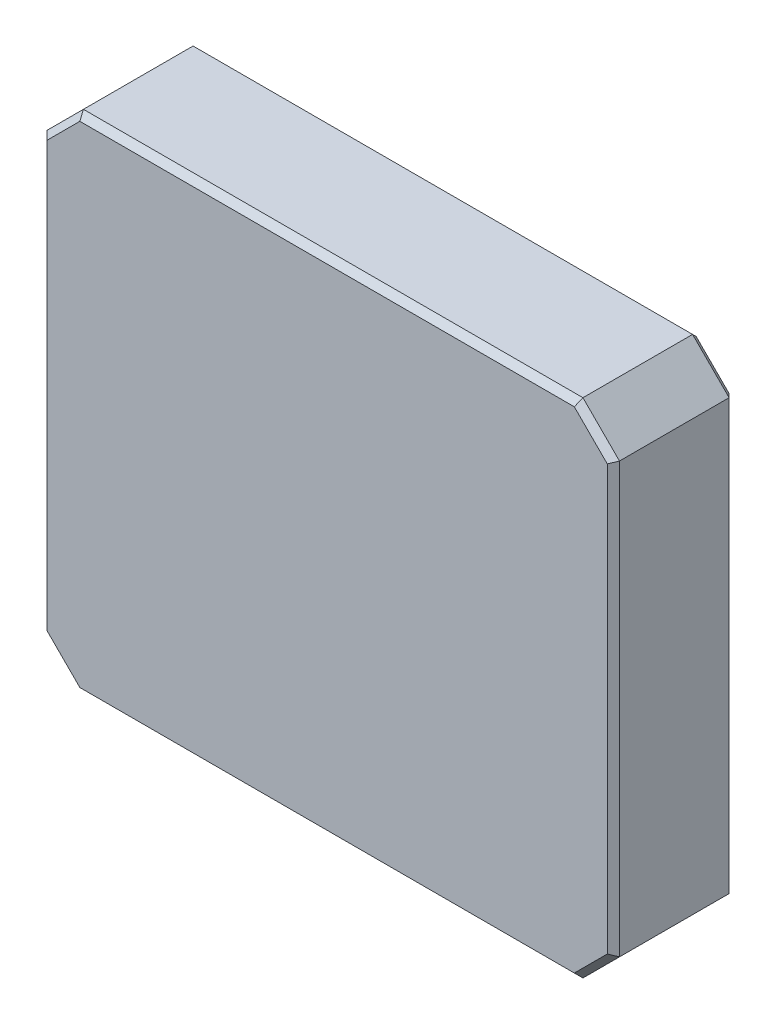
ISO-10303-21;
HEADER;
FILE_DESCRIPTION(('STEP AP214'),'2;1');
FILE_NAME('part.step','',(''),(''),'','','');
FILE_SCHEMA(('AUTOMOTIVE_DESIGN { 1 0 10303 214 1 1 1 1 }'));
ENDSEC;
DATA;
#1=APPLICATION_CONTEXT('core data for automotive mechanical design processes');
#2=APPLICATION_PROTOCOL_DEFINITION('international standard','automotive_design',2000,#1);
#3=PRODUCT_CONTEXT('',#1,'mechanical');
#4=PRODUCT('Part','Part','',(#3));
#5=PRODUCT_RELATED_PRODUCT_CATEGORY('part','',(#4));
#6=PRODUCT_DEFINITION_FORMATION('','',#4);
#7=PRODUCT_DEFINITION_CONTEXT('part definition',#1,'design');
#8=PRODUCT_DEFINITION('design','',#6,#7);
#9=PRODUCT_DEFINITION_SHAPE('','',#8);
#10=(LENGTH_UNIT() NAMED_UNIT(*) SI_UNIT(.MILLI.,.METRE.));
#11=(NAMED_UNIT(*) PLANE_ANGLE_UNIT() SI_UNIT($,.RADIAN.));
#12=(NAMED_UNIT(*) SI_UNIT($,.STERADIAN.) SOLID_ANGLE_UNIT());
#13=UNCERTAINTY_MEASURE_WITH_UNIT(LENGTH_MEASURE(1.E-05),#10,'distance_accuracy_value','');
#14=(GEOMETRIC_REPRESENTATION_CONTEXT(3) GLOBAL_UNCERTAINTY_ASSIGNED_CONTEXT((#13)) GLOBAL_UNIT_ASSIGNED_CONTEXT((#10,
#11,#12)) REPRESENTATION_CONTEXT('',''));
#15=CARTESIAN_POINT('',(0.,0.,0.));
#16=DIRECTION('',(0.,0.,1.));
#17=DIRECTION('',(1.,0.,0.));
#18=AXIS2_PLACEMENT_3D('',#15,#16,#17);
#19=CARTESIAN_POINT('',(-47.,-35.25,20.));
#20=DIRECTION('',(1.,0.,0.));
#21=DIRECTION('',(0.,0.,-1.));
#22=AXIS2_PLACEMENT_3D('',#19,#20,#21);
#23=PLANE('',#22);
#24=DIRECTION('',(0.,0.,-1.));
#25=VECTOR('',#24,1.);
#26=CARTESIAN_POINT('',(-47.,-35.25,20.));
#27=LINE('',#26,#25);
#28=CARTESIAN_POINT('',(-47.,-35.25,19.));
#29=VERTEX_POINT('',#28);
#30=CARTESIAN_POINT('',(-47.,-35.25,1.));
#31=VERTEX_POINT('',#30);
#32=EDGE_CURVE('E174',#29,#31,#27,.T.);
#33=ORIENTED_EDGE('',*,*,#32,.F.);
#34=DIRECTION('',(0.,1.,0.));
#35=VECTOR('',#34,1.);
#36=CARTESIAN_POINT('',(-47.,-35.25,19.));
#37=LINE('',#36,#35);
#38=CARTESIAN_POINT('',(-47.,35.25,19.));
#39=VERTEX_POINT('',#38);
#40=EDGE_CURVE('E215',#29,#39,#37,.T.);
#41=ORIENTED_EDGE('',*,*,#40,.T.);
#42=DIRECTION('',(0.,0.,-1.));
#43=VECTOR('',#42,1.);
#44=CARTESIAN_POINT('',(-47.,35.25,20.));
#45=LINE('',#44,#43);
#46=CARTESIAN_POINT('',(-47.,35.25,1.));
#47=VERTEX_POINT('',#46);
#48=EDGE_CURVE('E247',#39,#47,#45,.T.);
#49=ORIENTED_EDGE('',*,*,#48,.T.);
#50=DIRECTION('',(0.,-1.,0.));
#51=VECTOR('',#50,1.);
#52=CARTESIAN_POINT('',(-47.,-35.25,1.));
#53=LINE('',#52,#51);
#54=EDGE_CURVE('E213',#47,#31,#53,.T.);
#55=ORIENTED_EDGE('',*,*,#54,.T.);
#56=EDGE_LOOP('',(#33,#41,#49,#55));
#57=FACE_BOUND('',#56,.T.);
#58=ADVANCED_FACE('F38',(#57),#23,.F.);
#59=CARTESIAN_POINT('',(-47.,-35.25,20.));
#60=DIRECTION('',(0.707106781186548,0.707106781186548,0.));
#61=DIRECTION('',(-0.707106781186548,0.707106781186548,0.));
#62=AXIS2_PLACEMENT_3D('',#59,#60,#61);
#63=PLANE('',#62);
#64=DIRECTION('',(0.,0.,-1.));
#65=VECTOR('',#64,1.);
#66=CARTESIAN_POINT('',(-41.,-41.25,20.));
#67=LINE('',#66,#65);
#68=CARTESIAN_POINT('',(-41.,-41.25,19.));
#69=VERTEX_POINT('',#68);
#70=CARTESIAN_POINT('',(-41.,-41.25,1.));
#71=VERTEX_POINT('',#70);
#72=EDGE_CURVE('E312',#69,#71,#67,.T.);
#73=ORIENTED_EDGE('',*,*,#72,.F.);
#74=DIRECTION('',(-0.707106781186548,0.707106781186548,0.));
#75=VECTOR('',#74,1.);
#76=CARTESIAN_POINT('',(-47.,-35.25,19.));
#77=LINE('',#76,#75);
#78=EDGE_CURVE('E211',#69,#29,#77,.T.);
#79=ORIENTED_EDGE('',*,*,#78,.T.);
#80=ORIENTED_EDGE('',*,*,#32,.T.);
#81=DIRECTION('',(0.707106781186548,-0.707106781186548,0.));
#82=VECTOR('',#81,1.);
#83=CARTESIAN_POINT('',(-41.,-41.25,1.));
#84=LINE('',#83,#82);
#85=EDGE_CURVE('E209',#31,#71,#84,.T.);
#86=ORIENTED_EDGE('',*,*,#85,.T.);
#87=EDGE_LOOP('',(#73,#79,#80,#86));
#88=FACE_BOUND('',#87,.T.);
#89=ADVANCED_FACE('F370',(#88),#63,.F.);
#90=CARTESIAN_POINT('',(-41.,-41.25,20.));
#91=DIRECTION('',(0.,1.,0.));
#92=DIRECTION('',(0.,0.,1.));
#93=AXIS2_PLACEMENT_3D('',#90,#91,#92);
#94=PLANE('',#93);
#95=DIRECTION('',(0.,0.,-1.));
#96=VECTOR('',#95,1.);
#97=CARTESIAN_POINT('',(41.,-41.25,20.));
#98=LINE('',#97,#96);
#99=CARTESIAN_POINT('',(41.,-41.25,19.));
#100=VERTEX_POINT('',#99);
#101=CARTESIAN_POINT('',(41.,-41.25,1.));
#102=VERTEX_POINT('',#101);
#103=EDGE_CURVE('E309',#100,#102,#98,.T.);
#104=ORIENTED_EDGE('',*,*,#103,.F.);
#105=DIRECTION('',(-1.,0.,0.));
#106=VECTOR('',#105,1.);
#107=CARTESIAN_POINT('',(-41.,-41.25,19.));
#108=LINE('',#107,#106);
#109=EDGE_CURVE('E207',#100,#69,#108,.T.);
#110=ORIENTED_EDGE('',*,*,#109,.T.);
#111=ORIENTED_EDGE('',*,*,#72,.T.);
#112=DIRECTION('',(1.,0.,0.));
#113=VECTOR('',#112,1.);
#114=CARTESIAN_POINT('',(41.,-41.25,1.));
#115=LINE('',#114,#113);
#116=EDGE_CURVE('E205',#71,#102,#115,.T.);
#117=ORIENTED_EDGE('',*,*,#116,.T.);
#118=EDGE_LOOP('',(#104,#110,#111,#117));
#119=FACE_BOUND('',#118,.T.);
#120=ADVANCED_FACE('F353',(#119),#94,.F.);
#121=CARTESIAN_POINT('',(41.,-41.25,20.));
#122=DIRECTION('',(-0.707106781186548,0.707106781186548,0.));
#123=DIRECTION('',(-0.707106781186548,-0.707106781186548,0.));
#124=AXIS2_PLACEMENT_3D('',#121,#122,#123);
#125=PLANE('',#124);
#126=DIRECTION('',(0.,0.,-1.));
#127=VECTOR('',#126,1.);
#128=CARTESIAN_POINT('',(47.,-35.25,20.));
#129=LINE('',#128,#127);
#130=CARTESIAN_POINT('',(47.,-35.25,19.));
#131=VERTEX_POINT('',#130);
#132=CARTESIAN_POINT('',(47.,-35.25,1.));
#133=VERTEX_POINT('',#132);
#134=EDGE_CURVE('E306',#131,#133,#129,.T.);
#135=ORIENTED_EDGE('',*,*,#134,.F.);
#136=DIRECTION('',(-0.707106781186548,-0.707106781186548,0.));
#137=VECTOR('',#136,1.);
#138=CARTESIAN_POINT('',(41.,-41.25,19.));
#139=LINE('',#138,#137);
#140=EDGE_CURVE('E203',#131,#100,#139,.T.);
#141=ORIENTED_EDGE('',*,*,#140,.T.);
#142=ORIENTED_EDGE('',*,*,#103,.T.);
#143=DIRECTION('',(0.707106781186548,0.707106781186548,0.));
#144=VECTOR('',#143,1.);
#145=CARTESIAN_POINT('',(47.,-35.25,1.));
#146=LINE('',#145,#144);
#147=EDGE_CURVE('E201',#102,#133,#146,.T.);
#148=ORIENTED_EDGE('',*,*,#147,.T.);
#149=EDGE_LOOP('',(#135,#141,#142,#148));
#150=FACE_BOUND('',#149,.T.);
#151=ADVANCED_FACE('F351',(#150),#125,.F.);
#152=CARTESIAN_POINT('',(47.,-35.25,20.));
#153=DIRECTION('',(-1.,0.,0.));
#154=DIRECTION('',(0.,-1.,0.));
#155=AXIS2_PLACEMENT_3D('',#152,#153,#154);
#156=PLANE('',#155);
#157=DIRECTION('',(0.,0.,-1.));
#158=VECTOR('',#157,1.);
#159=CARTESIAN_POINT('',(47.,35.25,20.));
#160=LINE('',#159,#158);
#161=CARTESIAN_POINT('',(47.,35.25,19.));
#162=VERTEX_POINT('',#161);
#163=CARTESIAN_POINT('',(47.,35.25,1.));
#164=VERTEX_POINT('',#163);
#165=EDGE_CURVE('E300',#162,#164,#160,.T.);
#166=ORIENTED_EDGE('',*,*,#165,.F.);
#167=DIRECTION('',(0.,-1.,0.));
#168=VECTOR('',#167,1.);
#169=CARTESIAN_POINT('',(47.,-35.25,19.));
#170=LINE('',#169,#168);
#171=EDGE_CURVE('E199',#162,#131,#170,.T.);
#172=ORIENTED_EDGE('',*,*,#171,.T.);
#173=ORIENTED_EDGE('',*,*,#134,.T.);
#174=DIRECTION('',(0.,1.,0.));
#175=VECTOR('',#174,1.);
#176=CARTESIAN_POINT('',(47.,35.25,1.));
#177=LINE('',#176,#175);
#178=EDGE_CURVE('E197',#133,#164,#177,.T.);
#179=ORIENTED_EDGE('',*,*,#178,.T.);
#180=EDGE_LOOP('',(#166,#172,#173,#179));
#181=FACE_BOUND('',#180,.T.);
#182=ADVANCED_FACE('F338',(#181),#156,.F.);
#183=CARTESIAN_POINT('',(41.,41.25,20.));
#184=DIRECTION('',(-0.707106781186548,-0.707106781186548,0.));
#185=DIRECTION('',(0.707106781186548,-0.707106781186548,0.));
#186=AXIS2_PLACEMENT_3D('',#183,#184,#185);
#187=PLANE('',#186);
#188=DIRECTION('',(0.,0.,-1.));
#189=VECTOR('',#188,1.);
#190=CARTESIAN_POINT('',(41.,41.25,20.));
#191=LINE('',#190,#189);
#192=CARTESIAN_POINT('',(41.,41.25,19.));
#193=VERTEX_POINT('',#192);
#194=CARTESIAN_POINT('',(41.,41.25,1.));
#195=VERTEX_POINT('',#194);
#196=EDGE_CURVE('E294',#193,#195,#191,.T.);
#197=ORIENTED_EDGE('',*,*,#196,.F.);
#198=DIRECTION('',(0.707106781186548,-0.707106781186548,0.));
#199=VECTOR('',#198,1.);
#200=CARTESIAN_POINT('',(41.,41.25,19.));
#201=LINE('',#200,#199);
#202=EDGE_CURVE('E195',#193,#162,#201,.T.);
#203=ORIENTED_EDGE('',*,*,#202,.T.);
#204=ORIENTED_EDGE('',*,*,#165,.T.);
#205=DIRECTION('',(-0.707106781186548,0.707106781186548,0.));
#206=VECTOR('',#205,1.);
#207=CARTESIAN_POINT('',(41.,41.25,1.));
#208=LINE('',#207,#206);
#209=EDGE_CURVE('E193',#164,#195,#208,.T.);
#210=ORIENTED_EDGE('',*,*,#209,.T.);
#211=EDGE_LOOP('',(#197,#203,#204,#210));
#212=FACE_BOUND('',#211,.T.);
#213=ADVANCED_FACE('F334',(#212),#187,.F.);
#214=CARTESIAN_POINT('',(-41.,41.25,20.));
#215=DIRECTION('',(0.,-1.,0.));
#216=DIRECTION('',(1.,0.,0.));
#217=AXIS2_PLACEMENT_3D('',#214,#215,#216);
#218=PLANE('',#217);
#219=DIRECTION('',(0.,0.,-1.));
#220=VECTOR('',#219,1.);
#221=CARTESIAN_POINT('',(-41.,41.25,20.));
#222=LINE('',#221,#220);
#223=CARTESIAN_POINT('',(-41.,41.25,19.));
#224=VERTEX_POINT('',#223);
#225=CARTESIAN_POINT('',(-41.,41.25,1.));
#226=VERTEX_POINT('',#225);
#227=EDGE_CURVE('E292',#224,#226,#222,.T.);
#228=ORIENTED_EDGE('',*,*,#227,.F.);
#229=DIRECTION('',(1.,0.,0.));
#230=VECTOR('',#229,1.);
#231=CARTESIAN_POINT('',(-41.,41.25,19.));
#232=LINE('',#231,#230);
#233=EDGE_CURVE('E191',#224,#193,#232,.T.);
#234=ORIENTED_EDGE('',*,*,#233,.T.);
#235=ORIENTED_EDGE('',*,*,#196,.T.);
#236=DIRECTION('',(-1.,0.,0.));
#237=VECTOR('',#236,1.);
#238=CARTESIAN_POINT('',(-41.,41.25,1.));
#239=LINE('',#238,#237);
#240=EDGE_CURVE('E189',#195,#226,#239,.T.);
#241=ORIENTED_EDGE('',*,*,#240,.T.);
#242=EDGE_LOOP('',(#228,#234,#235,#241));
#243=FACE_BOUND('',#242,.T.);
#244=ADVANCED_FACE('F291',(#243),#218,.F.);
#245=CARTESIAN_POINT('',(-47.,35.25,20.));
#246=DIRECTION('',(0.707106781186548,-0.707106781186548,0.));
#247=DIRECTION('',(0.707106781186548,0.707106781186548,0.));
#248=AXIS2_PLACEMENT_3D('',#245,#246,#247);
#249=PLANE('',#248);
#250=ORIENTED_EDGE('',*,*,#48,.F.);
#251=DIRECTION('',(0.707106781186548,0.707106781186548,0.));
#252=VECTOR('',#251,1.);
#253=CARTESIAN_POINT('',(-47.,35.25,19.));
#254=LINE('',#253,#252);
#255=EDGE_CURVE('E161',#39,#224,#254,.T.);
#256=ORIENTED_EDGE('',*,*,#255,.T.);
#257=ORIENTED_EDGE('',*,*,#227,.T.);
#258=DIRECTION('',(-0.707106781186548,-0.707106781186548,0.));
#259=VECTOR('',#258,1.);
#260=CARTESIAN_POINT('',(-47.,35.25,1.));
#261=LINE('',#260,#259);
#262=EDGE_CURVE('E180',#226,#47,#261,.T.);
#263=ORIENTED_EDGE('',*,*,#262,.T.);
#264=EDGE_LOOP('',(#250,#256,#257,#263));
#265=FACE_BOUND('',#264,.T.);
#266=ADVANCED_FACE('F297',(#265),#249,.F.);
#267=CARTESIAN_POINT('',(0.,0.,20.));
#268=DIRECTION('',(0.,0.,-1.));
#269=DIRECTION('',(-1.,0.,0.));
#270=AXIS2_PLACEMENT_3D('',#267,#268,#269);
#271=PLANE('',#270);
#272=DIRECTION('',(-1.,0.,0.));
#273=VECTOR('',#272,1.);
#274=CARTESIAN_POINT('',(0.,40.25,20.));
#275=LINE('',#274,#273);
#276=CARTESIAN_POINT('',(40.5857864376269,40.25,20.));
#277=VERTEX_POINT('',#276);
#278=CARTESIAN_POINT('',(-40.5857864376269,40.25,20.));
#279=VERTEX_POINT('',#278);
#280=EDGE_CURVE('E178',#277,#279,#275,.T.);
#281=ORIENTED_EDGE('',*,*,#280,.T.);
#282=DIRECTION('',(-0.707106781186548,-0.707106781186548,0.));
#283=VECTOR('',#282,1.);
#284=CARTESIAN_POINT('',(-40.4178932188134,40.4178932188134,20.));
#285=LINE('',#284,#283);
#286=CARTESIAN_POINT('',(-46.,34.8357864376269,20.));
#287=VERTEX_POINT('',#286);
#288=EDGE_CURVE('E159',#279,#287,#285,.T.);
#289=ORIENTED_EDGE('',*,*,#288,.T.);
#290=DIRECTION('',(0.,-1.,0.));
#291=VECTOR('',#290,1.);
#292=CARTESIAN_POINT('',(-46.,0.,20.));
#293=LINE('',#292,#291);
#294=CARTESIAN_POINT('',(-46.,-34.8357864376269,20.));
#295=VERTEX_POINT('',#294);
#296=EDGE_CURVE('E167',#287,#295,#293,.T.);
#297=ORIENTED_EDGE('',*,*,#296,.T.);
#298=DIRECTION('',(0.707106781186548,-0.707106781186548,0.));
#299=VECTOR('',#298,1.);
#300=CARTESIAN_POINT('',(-40.4178932188134,-40.4178932188134,20.));
#301=LINE('',#300,#299);
#302=CARTESIAN_POINT('',(-40.5857864376269,-40.25,20.));
#303=VERTEX_POINT('',#302);
#304=EDGE_CURVE('E173',#295,#303,#301,.T.);
#305=ORIENTED_EDGE('',*,*,#304,.T.);
#306=DIRECTION('',(1.,0.,0.));
#307=VECTOR('',#306,1.);
#308=CARTESIAN_POINT('',(0.,-40.25,20.));
#309=LINE('',#308,#307);
#310=CARTESIAN_POINT('',(40.5857864376269,-40.25,20.));
#311=VERTEX_POINT('',#310);
#312=EDGE_CURVE('E318',#303,#311,#309,.T.);
#313=ORIENTED_EDGE('',*,*,#312,.T.);
#314=DIRECTION('',(0.707106781186548,0.707106781186548,0.));
#315=VECTOR('',#314,1.);
#316=CARTESIAN_POINT('',(40.4178932188134,-40.4178932188134,20.));
#317=LINE('',#316,#315);
#318=CARTESIAN_POINT('',(46.,-34.8357864376269,20.));
#319=VERTEX_POINT('',#318);
#320=EDGE_CURVE('E320',#311,#319,#317,.T.);
#321=ORIENTED_EDGE('',*,*,#320,.T.);
#322=DIRECTION('',(0.,1.,0.));
#323=VECTOR('',#322,1.);
#324=CARTESIAN_POINT('',(46.,0.,20.));
#325=LINE('',#324,#323);
#326=CARTESIAN_POINT('',(46.,34.8357864376269,20.));
#327=VERTEX_POINT('',#326);
#328=EDGE_CURVE('E322',#319,#327,#325,.T.);
#329=ORIENTED_EDGE('',*,*,#328,.T.);
#330=DIRECTION('',(-0.707106781186548,0.707106781186548,0.));
#331=VECTOR('',#330,1.);
#332=CARTESIAN_POINT('',(40.4178932188134,40.4178932188134,20.));
#333=LINE('',#332,#331);
#334=EDGE_CURVE('E184',#327,#277,#333,.T.);
#335=ORIENTED_EDGE('',*,*,#334,.T.);
#336=EDGE_LOOP('',(#281,#289,#297,#305,#313,#321,#329,#335));
#337=FACE_BOUND('',#336,.T.);
#338=ADVANCED_FACE('F176',(#337),#271,.F.);
#339=CARTESIAN_POINT('',(0.,0.,0.));
#340=DIRECTION('',(0.,0.,-1.));
#341=DIRECTION('',(-1.,0.,0.));
#342=AXIS2_PLACEMENT_3D('',#339,#340,#341);
#343=PLANE('',#342);
#344=DIRECTION('',(0.,1.,0.));
#345=VECTOR('',#344,1.);
#346=CARTESIAN_POINT('',(-46.,35.25,0.));
#347=LINE('',#346,#345);
#348=CARTESIAN_POINT('',(-46.,-34.8357864376269,0.));
#349=VERTEX_POINT('',#348);
#350=CARTESIAN_POINT('',(-46.,34.8357864376269,0.));
#351=VERTEX_POINT('',#350);
#352=EDGE_CURVE('E217',#349,#351,#347,.T.);
#353=ORIENTED_EDGE('',*,*,#352,.T.);
#354=DIRECTION('',(0.707106781186548,0.707106781186548,0.));
#355=VECTOR('',#354,1.);
#356=CARTESIAN_POINT('',(-40.2928932188135,40.5428932188135,0.));
#357=LINE('',#356,#355);
#358=CARTESIAN_POINT('',(-40.5857864376269,40.25,0.));
#359=VERTEX_POINT('',#358);
#360=EDGE_CURVE('E11',#351,#359,#357,.T.);
#361=ORIENTED_EDGE('',*,*,#360,.T.);
#362=DIRECTION('',(1.,0.,0.));
#363=VECTOR('',#362,1.);
#364=CARTESIAN_POINT('',(41.,40.25,0.));
#365=LINE('',#364,#363);
#366=CARTESIAN_POINT('',(40.5857864376269,40.25,0.));
#367=VERTEX_POINT('',#366);
#368=EDGE_CURVE('E48',#359,#367,#365,.T.);
#369=ORIENTED_EDGE('',*,*,#368,.T.);
#370=DIRECTION('',(0.707106781186548,-0.707106781186548,0.));
#371=VECTOR('',#370,1.);
#372=CARTESIAN_POINT('',(46.2928932188134,34.5428932188134,0.));
#373=LINE('',#372,#371);
#374=CARTESIAN_POINT('',(46.,34.8357864376269,0.));
#375=VERTEX_POINT('',#374);
#376=EDGE_CURVE('E227',#367,#375,#373,.T.);
#377=ORIENTED_EDGE('',*,*,#376,.T.);
#378=DIRECTION('',(0.,-1.,0.));
#379=VECTOR('',#378,1.);
#380=CARTESIAN_POINT('',(46.,-35.25,0.));
#381=LINE('',#380,#379);
#382=CARTESIAN_POINT('',(46.,-34.8357864376269,0.));
#383=VERTEX_POINT('',#382);
#384=EDGE_CURVE('E225',#375,#383,#381,.T.);
#385=ORIENTED_EDGE('',*,*,#384,.T.);
#386=DIRECTION('',(-0.707106781186548,-0.707106781186548,0.));
#387=VECTOR('',#386,1.);
#388=CARTESIAN_POINT('',(40.2928932188135,-40.5428932188135,0.));
#389=LINE('',#388,#387);
#390=CARTESIAN_POINT('',(40.5857864376269,-40.25,0.));
#391=VERTEX_POINT('',#390);
#392=EDGE_CURVE('E223',#383,#391,#389,.T.);
#393=ORIENTED_EDGE('',*,*,#392,.T.);
#394=DIRECTION('',(-1.,0.,0.));
#395=VECTOR('',#394,1.);
#396=CARTESIAN_POINT('',(-41.,-40.25,0.));
#397=LINE('',#396,#395);
#398=CARTESIAN_POINT('',(-40.5857864376269,-40.25,0.));
#399=VERTEX_POINT('',#398);
#400=EDGE_CURVE('E221',#391,#399,#397,.T.);
#401=ORIENTED_EDGE('',*,*,#400,.T.);
#402=DIRECTION('',(-0.707106781186548,0.707106781186548,0.));
#403=VECTOR('',#402,1.);
#404=CARTESIAN_POINT('',(-46.2928932188135,-34.5428932188135,0.));
#405=LINE('',#404,#403);
#406=EDGE_CURVE('E219',#399,#349,#405,.T.);
#407=ORIENTED_EDGE('',*,*,#406,.T.);
#408=EDGE_LOOP('',(#353,#361,#369,#377,#385,#393,#401,#407));
#409=FACE_BOUND('',#408,.T.);
#410=ADVANCED_FACE('F278',(#409),#343,.T.);
#411=CARTESIAN_POINT('',(40.4178932188134,-40.4178932188134,20.));
#412=DIRECTION('',(-0.500000000000001,0.500000000000001,-0.707106781186546));
#413=DIRECTION('',(0.707106781186548,0.707106781186548,0.));
#414=AXIS2_PLACEMENT_3D('',#411,#412,#413);
#415=PLANE('',#414);
#416=DIRECTION('',(-0.281084637714817,0.678598344545848,0.678598344545848));
#417=VECTOR('',#416,1.);
#418=CARTESIAN_POINT('',(37.3791613444088,-32.5085222105069,27.741477789493));
#419=LINE('',#418,#417);
#420=EDGE_CURVE('E241',#100,#311,#419,.T.);
#421=ORIENTED_EDGE('',*,*,#420,.F.);
#422=ORIENTED_EDGE('',*,*,#140,.F.);
#423=DIRECTION('',(-0.678598344545849,0.281084637714814,0.678598344545847));
#424=VECTOR('',#423,1.);
#425=CARTESIAN_POINT('',(44.494214731144,-34.2120697572452,21.5057852688559));
#426=LINE('',#425,#424);
#427=EDGE_CURVE('E244',#319,#131,#426,.F.);
#428=ORIENTED_EDGE('',*,*,#427,.F.);
#429=ORIENTED_EDGE('',*,*,#320,.F.);
#430=EDGE_LOOP('',(#421,#422,#428,#429));
#431=FACE_BOUND('',#430,.T.);
#432=ADVANCED_FACE('F347',(#431),#415,.F.);
#433=CARTESIAN_POINT('',(46.,0.,20.));
#434=DIRECTION('',(-0.707106781186546,0.,-0.707106781186549));
#435=DIRECTION('',(0.,1.,0.));
#436=AXIS2_PLACEMENT_3D('',#433,#434,#435);
#437=PLANE('',#436);
#438=ORIENTED_EDGE('',*,*,#427,.T.);
#439=ORIENTED_EDGE('',*,*,#171,.F.);
#440=DIRECTION('',(-0.678598344545848,-0.281084637714823,0.678598344545845));
#441=VECTOR('',#440,1.);
#442=CARTESIAN_POINT('',(39.3552977370324,32.0834606423745,26.6447022629675));
#443=LINE('',#442,#441);
#444=EDGE_CURVE('E238',#327,#162,#443,.F.);
#445=ORIENTED_EDGE('',*,*,#444,.F.);
#446=ORIENTED_EDGE('',*,*,#328,.F.);
#447=EDGE_LOOP('',(#438,#439,#445,#446));
#448=FACE_BOUND('',#447,.T.);
#449=ADVANCED_FACE('F341',(#448),#437,.F.);
#450=CARTESIAN_POINT('',(0.,-40.25,20.));
#451=DIRECTION('',(0.,0.707106781186547,-0.707106781186547));
#452=DIRECTION('',(1.,0.,0.));
#453=AXIS2_PLACEMENT_3D('',#450,#451,#452);
#454=PLANE('',#453);
#455=ORIENTED_EDGE('',*,*,#420,.T.);
#456=ORIENTED_EDGE('',*,*,#312,.F.);
#457=DIRECTION('',(0.281084637714826,0.678598344545846,0.678598344545846));
#458=VECTOR('',#457,1.);
#459=CARTESIAN_POINT('',(-40.604545985805,-40.2952895556355,19.9547104443645));
#460=LINE('',#459,#458);
#461=EDGE_CURVE('E235',#69,#303,#460,.T.);
#462=ORIENTED_EDGE('',*,*,#461,.F.);
#463=ORIENTED_EDGE('',*,*,#109,.F.);
#464=EDGE_LOOP('',(#455,#456,#462,#463));
#465=FACE_BOUND('',#464,.T.);
#466=ADVANCED_FACE('F377',(#465),#454,.F.);
#467=CARTESIAN_POINT('',(40.4178932188134,40.4178932188134,20.));
#468=DIRECTION('',(-0.499999999999998,-0.499999999999998,-0.70710678118655));
#469=DIRECTION('',(-0.707106781186548,0.707106781186548,0.));
#470=AXIS2_PLACEMENT_3D('',#467,#468,#469);
#471=PLANE('',#470);
#472=ORIENTED_EDGE('',*,*,#444,.T.);
#473=ORIENTED_EDGE('',*,*,#202,.F.);
#474=DIRECTION('',(-0.281084637714833,-0.678598344545841,0.678598344545848));
#475=VECTOR('',#474,1.);
#476=CARTESIAN_POINT('',(40.604545985805,40.2952895556355,19.9547104443645));
#477=LINE('',#476,#475);
#478=EDGE_CURVE('E232',#277,#193,#477,.F.);
#479=ORIENTED_EDGE('',*,*,#478,.F.);
#480=ORIENTED_EDGE('',*,*,#334,.F.);
#481=EDGE_LOOP('',(#472,#473,#479,#480));
#482=FACE_BOUND('',#481,.T.);
#483=ADVANCED_FACE('F329',(#482),#471,.F.);
#484=CARTESIAN_POINT('',(-40.4178932188134,-40.4178932188134,20.));
#485=DIRECTION('',(0.499999999999998,0.499999999999998,-0.70710678118655));
#486=DIRECTION('',(0.707106781186548,-0.707106781186548,0.));
#487=AXIS2_PLACEMENT_3D('',#484,#485,#486);
#488=PLANE('',#487);
#489=ORIENTED_EDGE('',*,*,#461,.T.);
#490=ORIENTED_EDGE('',*,*,#304,.F.);
#491=DIRECTION('',(0.678598344545846,0.281084637714826,0.678598344545846));
#492=VECTOR('',#491,1.);
#493=CARTESIAN_POINT('',(-39.3552977370324,-32.0834606423745,26.6447022629676));
#494=LINE('',#493,#492);
#495=EDGE_CURVE('E170',#29,#295,#494,.T.);
#496=ORIENTED_EDGE('',*,*,#495,.F.);
#497=ORIENTED_EDGE('',*,*,#78,.F.);
#498=EDGE_LOOP('',(#489,#490,#496,#497));
#499=FACE_BOUND('',#498,.T.);
#500=ADVANCED_FACE('F374',(#499),#488,.F.);
#501=CARTESIAN_POINT('',(0.,40.25,20.));
#502=DIRECTION('',(0.,-0.707106781186551,-0.707106781186544));
#503=DIRECTION('',(-1.,0.,0.));
#504=AXIS2_PLACEMENT_3D('',#501,#502,#503);
#505=PLANE('',#504);
#506=ORIENTED_EDGE('',*,*,#478,.T.);
#507=ORIENTED_EDGE('',*,*,#233,.F.);
#508=DIRECTION('',(0.281084637714825,-0.678598344545843,0.67859834454585));
#509=VECTOR('',#508,1.);
#510=CARTESIAN_POINT('',(-37.3791613444087,32.5085222105068,27.7414777894933));
#511=LINE('',#510,#509);
#512=EDGE_CURVE('E164',#279,#224,#511,.F.);
#513=ORIENTED_EDGE('',*,*,#512,.F.);
#514=ORIENTED_EDGE('',*,*,#280,.F.);
#515=EDGE_LOOP('',(#506,#507,#513,#514));
#516=FACE_BOUND('',#515,.T.);
#517=ADVANCED_FACE('F332',(#516),#505,.F.);
#518=CARTESIAN_POINT('',(-46.,0.,20.));
#519=DIRECTION('',(0.707106781186547,0.,-0.707106781186547));
#520=DIRECTION('',(0.,-1.,0.));
#521=AXIS2_PLACEMENT_3D('',#518,#519,#520);
#522=PLANE('',#521);
#523=ORIENTED_EDGE('',*,*,#495,.T.);
#524=ORIENTED_EDGE('',*,*,#296,.F.);
#525=DIRECTION('',(-0.678598344545848,0.281084637714817,-0.678598344545848));
#526=VECTOR('',#525,1.);
#527=CARTESIAN_POINT('',(-39.3552977370326,32.0834606423746,26.6447022629674));
#528=LINE('',#527,#526);
#529=EDGE_CURVE('E155',#39,#287,#528,.F.);
#530=ORIENTED_EDGE('',*,*,#529,.F.);
#531=ORIENTED_EDGE('',*,*,#40,.F.);
#532=EDGE_LOOP('',(#523,#524,#530,#531));
#533=FACE_BOUND('',#532,.T.);
#534=ADVANCED_FACE('F168',(#533),#522,.F.);
#535=CARTESIAN_POINT('',(-40.4178932188134,40.4178932188134,20.));
#536=DIRECTION('',(0.500000000000001,-0.500000000000001,-0.707106781186546));
#537=DIRECTION('',(-0.707106781186548,-0.707106781186548,0.));
#538=AXIS2_PLACEMENT_3D('',#535,#536,#537);
#539=PLANE('',#538);
#540=ORIENTED_EDGE('',*,*,#512,.T.);
#541=ORIENTED_EDGE('',*,*,#255,.F.);
#542=ORIENTED_EDGE('',*,*,#529,.T.);
#543=ORIENTED_EDGE('',*,*,#288,.F.);
#544=EDGE_LOOP('',(#540,#541,#542,#543));
#545=FACE_BOUND('',#544,.T.);
#546=ADVANCED_FACE('F157',(#545),#539,.F.);
#547=CARTESIAN_POINT('',(41.,-41.25,1.));
#548=DIRECTION('',(0.500000000000005,-0.500000000000005,-0.707106781186541));
#549=DIRECTION('',(-0.707106781186548,-0.707106781186548,0.));
#550=AXIS2_PLACEMENT_3D('',#547,#548,#549);
#551=PLANE('',#550);
#552=DIRECTION('',(0.281084637714814,-0.678598344545844,0.678598344545853));
#553=VECTOR('',#552,1.);
#554=CARTESIAN_POINT('',(34.52129696814,-25.6090272738957,-14.6409727261046));
#555=LINE('',#554,#553);
#556=EDGE_CURVE('E262',#391,#102,#555,.T.);
#557=ORIENTED_EDGE('',*,*,#556,.F.);
#558=ORIENTED_EDGE('',*,*,#392,.F.);
#559=DIRECTION('',(0.678598344545845,-0.281084637714811,0.678598344545852));
#560=VECTOR('',#559,1.);
#561=CARTESIAN_POINT('',(45.3814871396611,-34.5795900223724,-0.61851286033895));
#562=LINE('',#561,#560);
#563=EDGE_CURVE('E43',#133,#383,#562,.F.);
#564=ORIENTED_EDGE('',*,*,#563,.F.);
#565=ORIENTED_EDGE('',*,*,#147,.F.);
#566=EDGE_LOOP('',(#557,#558,#564,#565));
#567=FACE_BOUND('',#566,.T.);
#568=ADVANCED_FACE('F41',(#567),#551,.T.);
#569=CARTESIAN_POINT('',(47.,-35.25,1.));
#570=DIRECTION('',(0.707106781186551,0.,-0.707106781186544));
#571=DIRECTION('',(0.,-1.,0.));
#572=AXIS2_PLACEMENT_3D('',#569,#570,#571);
#573=PLANE('',#572);
#574=ORIENTED_EDGE('',*,*,#563,.T.);
#575=ORIENTED_EDGE('',*,*,#384,.F.);
#576=DIRECTION('',(0.678598344545842,0.281084637714829,0.678598344545849));
#577=VECTOR('',#576,1.);
#578=CARTESIAN_POINT('',(33.5525783269462,29.679895564071,-12.4474216730539));
#579=LINE('',#578,#577);
#580=EDGE_CURVE('E260',#164,#375,#579,.F.);
#581=ORIENTED_EDGE('',*,*,#580,.F.);
#582=ORIENTED_EDGE('',*,*,#178,.F.);
#583=EDGE_LOOP('',(#574,#575,#581,#582));
#584=FACE_BOUND('',#583,.T.);
#585=ADVANCED_FACE('F273',(#584),#573,.T.);
#586=CARTESIAN_POINT('',(-41.,-41.25,1.));
#587=DIRECTION('',(0.,-0.707106781186552,-0.707106781186543));
#588=DIRECTION('',(-1.,0.,0.));
#589=AXIS2_PLACEMENT_3D('',#586,#587,#588);
#590=PLANE('',#589);
#591=ORIENTED_EDGE('',*,*,#556,.T.);
#592=ORIENTED_EDGE('',*,*,#116,.F.);
#593=DIRECTION('',(-0.281084637714814,-0.678598344545844,0.678598344545853));
#594=VECTOR('',#593,1.);
#595=CARTESIAN_POINT('',(-40.3295900223724,-39.6314871396611,-0.618512860338931));
#596=LINE('',#595,#594);
#597=EDGE_CURVE('E257',#399,#71,#596,.T.);
#598=ORIENTED_EDGE('',*,*,#597,.F.);
#599=ORIENTED_EDGE('',*,*,#400,.F.);
#600=EDGE_LOOP('',(#591,#592,#598,#599));
#601=FACE_BOUND('',#600,.T.);
#602=ADVANCED_FACE('F355',(#601),#590,.T.);
#603=CARTESIAN_POINT('',(41.,41.25,1.));
#604=DIRECTION('',(0.5,0.5,-0.707106781186548));
#605=DIRECTION('',(0.707106781186548,-0.707106781186548,0.));
#606=AXIS2_PLACEMENT_3D('',#603,#604,#605);
#607=PLANE('',#606);
#608=ORIENTED_EDGE('',*,*,#580,.T.);
#609=ORIENTED_EDGE('',*,*,#376,.F.);
#610=DIRECTION('',(0.281084637714839,0.678598344545835,0.678598344545851));
#611=VECTOR('',#610,1.);
#612=CARTESIAN_POINT('',(41.,41.25,1.));
#613=LINE('',#612,#611);
#614=EDGE_CURVE('E254',#195,#367,#613,.F.);
#615=ORIENTED_EDGE('',*,*,#614,.F.);
#616=ORIENTED_EDGE('',*,*,#209,.F.);
#617=EDGE_LOOP('',(#608,#609,#615,#616));
#618=FACE_BOUND('',#617,.T.);
#619=ADVANCED_FACE('F282',(#618),#607,.T.);
#620=CARTESIAN_POINT('',(-47.,-35.25,1.));
#621=DIRECTION('',(-0.500000000000005,-0.500000000000005,-0.707106781186541));
#622=DIRECTION('',(-0.707106781186548,0.707106781186548,0.));
#623=AXIS2_PLACEMENT_3D('',#620,#621,#622);
#624=PLANE('',#623);
#625=ORIENTED_EDGE('',*,*,#597,.T.);
#626=ORIENTED_EDGE('',*,*,#85,.F.);
#627=DIRECTION('',(-0.678598344545844,-0.281084637714814,0.678598344545853));
#628=VECTOR('',#627,1.);
#629=CARTESIAN_POINT('',(-47.,-35.25,1.));
#630=LINE('',#629,#628);
#631=EDGE_CURVE('E251',#349,#31,#630,.T.);
#632=ORIENTED_EDGE('',*,*,#631,.F.);
#633=ORIENTED_EDGE('',*,*,#406,.F.);
#634=EDGE_LOOP('',(#625,#626,#632,#633));
#635=FACE_BOUND('',#634,.T.);
#636=ADVANCED_FACE('F359',(#635),#624,.T.);
#637=CARTESIAN_POINT('',(-41.,41.25,1.));
#638=DIRECTION('',(0.,0.707106781186556,-0.707106781186539));
#639=DIRECTION('',(1.,0.,0.));
#640=AXIS2_PLACEMENT_3D('',#637,#638,#639);
#641=PLANE('',#640);
#642=ORIENTED_EDGE('',*,*,#614,.T.);
#643=ORIENTED_EDGE('',*,*,#368,.F.);
#644=DIRECTION('',(-0.281084637714821,0.678598344545839,0.678598344545855));
#645=VECTOR('',#644,1.);
#646=CARTESIAN_POINT('',(-41.,41.25,1.));
#647=LINE('',#646,#645);
#648=EDGE_CURVE('E56',#226,#359,#647,.F.);
#649=ORIENTED_EDGE('',*,*,#648,.F.);
#650=ORIENTED_EDGE('',*,*,#240,.F.);
#651=EDGE_LOOP('',(#642,#643,#649,#650));
#652=FACE_BOUND('',#651,.T.);
#653=ADVANCED_FACE('F286',(#652),#641,.T.);
#654=CARTESIAN_POINT('',(-47.,-35.25,1.));
#655=DIRECTION('',(-0.707106781186552,0.,-0.707106781186543));
#656=DIRECTION('',(0.,1.,0.));
#657=AXIS2_PLACEMENT_3D('',#654,#655,#656);
#658=PLANE('',#657);
#659=ORIENTED_EDGE('',*,*,#631,.T.);
#660=ORIENTED_EDGE('',*,*,#54,.F.);
#661=DIRECTION('',(0.678598344545844,-0.281084637714813,-0.678598344545853));
#662=VECTOR('',#661,1.);
#663=CARTESIAN_POINT('',(-33.5525783269469,29.6798955640716,-12.4474216730533));
#664=LINE('',#663,#662);
#665=EDGE_CURVE('E248',#351,#47,#664,.F.);
#666=ORIENTED_EDGE('',*,*,#665,.F.);
#667=ORIENTED_EDGE('',*,*,#352,.F.);
#668=EDGE_LOOP('',(#659,#660,#666,#667));
#669=FACE_BOUND('',#668,.T.);
#670=ADVANCED_FACE('F366',(#669),#658,.T.);
#671=CARTESIAN_POINT('',(-47.,35.25,1.));
#672=DIRECTION('',(-0.500000000000005,0.500000000000005,-0.70710678118654));
#673=DIRECTION('',(0.707106781186548,0.707106781186548,0.));
#674=AXIS2_PLACEMENT_3D('',#671,#672,#673);
#675=PLANE('',#674);
#676=ORIENTED_EDGE('',*,*,#648,.T.);
#677=ORIENTED_EDGE('',*,*,#360,.F.);
#678=ORIENTED_EDGE('',*,*,#665,.T.);
#679=ORIENTED_EDGE('',*,*,#262,.F.);
#680=EDGE_LOOP('',(#676,#677,#678,#679));
#681=FACE_BOUND('',#680,.T.);
#682=ADVANCED_FACE('F364',(#681),#675,.T.);
#683=CLOSED_SHELL('',(#58,#89,#120,#151,#182,#213,#244,#266,#338,#410,#432,#449,#466,#483,#500,
#517,#534,#546,#568,#585,#602,#619,#636,#653,#670,#682));
#684=MANIFOLD_SOLID_BREP('B2',#683);
#685=ADVANCED_BREP_SHAPE_REPRESENTATION('',(#18,#684),#14);
#686=SHAPE_DEFINITION_REPRESENTATION(#9,#685);
ENDSEC;
END-ISO-10303-21;
